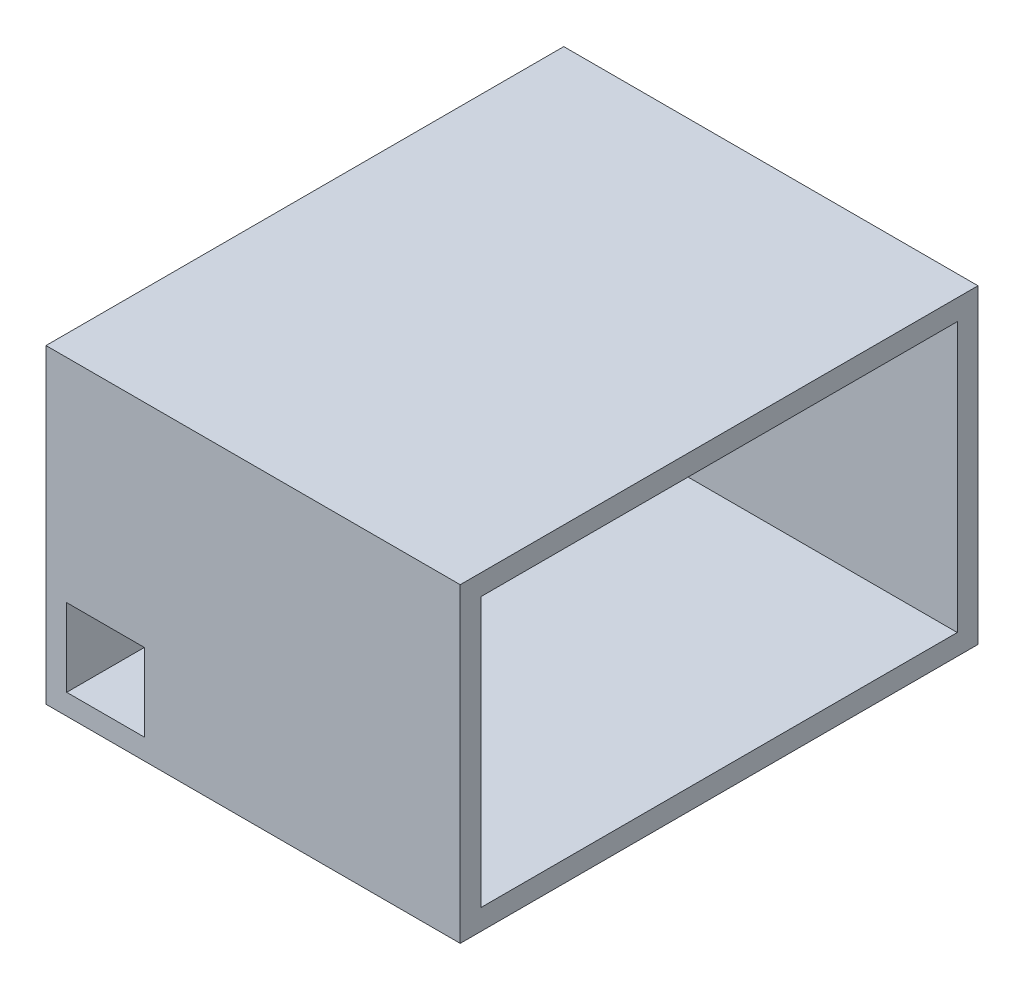
ISO-10303-21;
HEADER;
FILE_DESCRIPTION(('STEP AP214'),'2;1');
FILE_NAME('part.step','',(''),(''),'','','');
FILE_SCHEMA(('AUTOMOTIVE_DESIGN { 1 0 10303 214 1 1 1 1 }'));
ENDSEC;
DATA;
#1=APPLICATION_CONTEXT('core data for automotive mechanical design processes');
#2=APPLICATION_PROTOCOL_DEFINITION('international standard','automotive_design',2000,#1);
#3=PRODUCT_CONTEXT('',#1,'mechanical');
#4=PRODUCT('Part','Part','',(#3));
#5=PRODUCT_RELATED_PRODUCT_CATEGORY('part','',(#4));
#6=PRODUCT_DEFINITION_FORMATION('','',#4);
#7=PRODUCT_DEFINITION_CONTEXT('part definition',#1,'design');
#8=PRODUCT_DEFINITION('design','',#6,#7);
#9=PRODUCT_DEFINITION_SHAPE('','',#8);
#10=(LENGTH_UNIT() NAMED_UNIT(*) SI_UNIT(.MILLI.,.METRE.));
#11=(NAMED_UNIT(*) PLANE_ANGLE_UNIT() SI_UNIT($,.RADIAN.));
#12=(NAMED_UNIT(*) SI_UNIT($,.STERADIAN.) SOLID_ANGLE_UNIT());
#13=UNCERTAINTY_MEASURE_WITH_UNIT(LENGTH_MEASURE(1.E-05),#10,'distance_accuracy_value','');
#14=(GEOMETRIC_REPRESENTATION_CONTEXT(3) GLOBAL_UNCERTAINTY_ASSIGNED_CONTEXT((#13)) GLOBAL_UNIT_ASSIGNED_CONTEXT((#10,
#11,#12)) REPRESENTATION_CONTEXT('',''));
#15=CARTESIAN_POINT('',(0.,0.,0.));
#16=DIRECTION('',(0.,0.,1.));
#17=DIRECTION('',(1.,0.,0.));
#18=AXIS2_PLACEMENT_3D('',#15,#16,#17);
#19=CARTESIAN_POINT('',(-36.,0.,46.));
#20=DIRECTION('',(0.,0.,1.));
#21=DIRECTION('',(1.,0.,0.));
#22=AXIS2_PLACEMENT_3D('',#19,#20,#21);
#23=PLANE('',#22);
#24=DIRECTION('',(1.,0.,0.));
#25=VECTOR('',#24,1.);
#26=CARTESIAN_POINT('',(0.,19.,46.));
#27=LINE('',#26,#25);
#28=CARTESIAN_POINT('',(-36.,19.,46.));
#29=VERTEX_POINT('',#28);
#30=CARTESIAN_POINT('',(-21.,19.,46.));
#31=VERTEX_POINT('',#30);
#32=EDGE_CURVE('E133',#29,#31,#27,.T.);
#33=ORIENTED_EDGE('',*,*,#32,.F.);
#34=DIRECTION('',(0.,-1.,0.));
#35=VECTOR('',#34,1.);
#36=CARTESIAN_POINT('',(-36.,0.,46.));
#37=LINE('',#36,#35);
#38=CARTESIAN_POINT('',(-36.,56.,46.));
#39=VERTEX_POINT('',#38);
#40=EDGE_CURVE('E251',#39,#29,#37,.T.);
#41=ORIENTED_EDGE('',*,*,#40,.F.);
#42=DIRECTION('',(1.,0.,0.));
#43=VECTOR('',#42,1.);
#44=CARTESIAN_POINT('',(-36.,56.,46.));
#45=LINE('',#44,#43);
#46=CARTESIAN_POINT('',(40.,56.,46.));
#47=VERTEX_POINT('',#46);
#48=EDGE_CURVE('E147',#39,#47,#45,.T.);
#49=ORIENTED_EDGE('',*,*,#48,.T.);
#50=DIRECTION('',(0.,-1.,0.));
#51=VECTOR('',#50,1.);
#52=CARTESIAN_POINT('',(40.,0.,46.));
#53=LINE('',#52,#51);
#54=CARTESIAN_POINT('',(40.,4.,46.));
#55=VERTEX_POINT('',#54);
#56=EDGE_CURVE('E144',#47,#55,#53,.T.);
#57=ORIENTED_EDGE('',*,*,#56,.T.);
#58=DIRECTION('',(1.,0.,0.));
#59=VECTOR('',#58,1.);
#60=CARTESIAN_POINT('',(-36.,4.,46.));
#61=LINE('',#60,#59);
#62=CARTESIAN_POINT('',(-21.,4.,46.));
#63=VERTEX_POINT('',#62);
#64=EDGE_CURVE('E127',#63,#55,#61,.T.);
#65=ORIENTED_EDGE('',*,*,#64,.F.);
#66=DIRECTION('',(0.,1.,0.));
#67=VECTOR('',#66,1.);
#68=CARTESIAN_POINT('',(-21.,0.,46.));
#69=LINE('',#68,#67);
#70=EDGE_CURVE('E137',#63,#31,#69,.T.);
#71=ORIENTED_EDGE('',*,*,#70,.T.);
#72=EDGE_LOOP('',(#33,#41,#49,#57,#65,#71));
#73=FACE_BOUND('',#72,.T.);
#74=ADVANCED_FACE('F41',(#73),#23,.F.);
#75=CARTESIAN_POINT('',(40.,60.,50.));
#76=DIRECTION('',(-1.,0.,0.));
#77=DIRECTION('',(0.,0.,1.));
#78=AXIS2_PLACEMENT_3D('',#75,#76,#77);
#79=PLANE('',#78);
#80=DIRECTION('',(0.,0.,-1.));
#81=VECTOR('',#80,1.);
#82=CARTESIAN_POINT('',(40.,0.,50.));
#83=LINE('',#82,#81);
#84=CARTESIAN_POINT('',(40.,0.,50.));
#85=VERTEX_POINT('',#84);
#86=CARTESIAN_POINT('',(40.,0.,-50.));
#87=VERTEX_POINT('',#86);
#88=EDGE_CURVE('E149',#85,#87,#83,.T.);
#89=ORIENTED_EDGE('',*,*,#88,.T.);
#90=DIRECTION('',(0.,-1.,0.));
#91=VECTOR('',#90,1.);
#92=CARTESIAN_POINT('',(40.,60.,-50.));
#93=LINE('',#92,#91);
#94=CARTESIAN_POINT('',(40.,60.,-50.));
#95=VERTEX_POINT('',#94);
#96=EDGE_CURVE('E11',#95,#87,#93,.T.);
#97=ORIENTED_EDGE('',*,*,#96,.F.);
#98=DIRECTION('',(0.,0.,-1.));
#99=VECTOR('',#98,1.);
#100=CARTESIAN_POINT('',(40.,60.,50.));
#101=LINE('',#100,#99);
#102=CARTESIAN_POINT('',(40.,60.,50.));
#103=VERTEX_POINT('',#102);
#104=EDGE_CURVE('E157',#103,#95,#101,.T.);
#105=ORIENTED_EDGE('',*,*,#104,.F.);
#106=DIRECTION('',(0.,-1.,0.));
#107=VECTOR('',#106,1.);
#108=CARTESIAN_POINT('',(40.,60.,50.));
#109=LINE('',#108,#107);
#110=EDGE_CURVE('E167',#103,#85,#109,.T.);
#111=ORIENTED_EDGE('',*,*,#110,.T.);
#112=EDGE_LOOP('',(#89,#97,#105,#111));
#113=FACE_BOUND('',#112,.T.);
#114=DIRECTION('',(0.,-1.,0.));
#115=VECTOR('',#114,1.);
#116=CARTESIAN_POINT('',(40.,0.,-46.));
#117=LINE('',#116,#115);
#118=CARTESIAN_POINT('',(40.,56.,-46.));
#119=VERTEX_POINT('',#118);
#120=CARTESIAN_POINT('',(40.,4.,-46.));
#121=VERTEX_POINT('',#120);
#122=EDGE_CURVE('E64',#119,#121,#117,.T.);
#123=ORIENTED_EDGE('',*,*,#122,.T.);
#124=DIRECTION('',(0.,0.,-1.));
#125=VECTOR('',#124,1.);
#126=CARTESIAN_POINT('',(40.,4.,0.));
#127=LINE('',#126,#125);
#128=EDGE_CURVE('E249',#55,#121,#127,.T.);
#129=ORIENTED_EDGE('',*,*,#128,.F.);
#130=ORIENTED_EDGE('',*,*,#56,.F.);
#131=DIRECTION('',(0.,0.,-1.));
#132=VECTOR('',#131,1.);
#133=CARTESIAN_POINT('',(40.,56.,0.));
#134=LINE('',#133,#132);
#135=EDGE_CURVE('E257',#47,#119,#134,.T.);
#136=ORIENTED_EDGE('',*,*,#135,.T.);
#137=EDGE_LOOP('',(#123,#129,#130,#136));
#138=FACE_BOUND('',#137,.T.);
#139=ADVANCED_FACE('F43',(#113,#138),#79,.F.);
#140=CARTESIAN_POINT('',(-40.,60.,-50.));
#141=DIRECTION('',(0.,0.,1.));
#142=DIRECTION('',(1.,0.,0.));
#143=AXIS2_PLACEMENT_3D('',#140,#141,#142);
#144=PLANE('',#143);
#145=DIRECTION('',(-1.,0.,0.));
#146=VECTOR('',#145,1.);
#147=CARTESIAN_POINT('',(-40.,0.,-50.));
#148=LINE('',#147,#146);
#149=CARTESIAN_POINT('',(-40.,0.,-50.));
#150=VERTEX_POINT('',#149);
#151=EDGE_CURVE('E170',#87,#150,#148,.T.);
#152=ORIENTED_EDGE('',*,*,#151,.T.);
#153=DIRECTION('',(0.,-1.,0.));
#154=VECTOR('',#153,1.);
#155=CARTESIAN_POINT('',(-40.,60.,-50.));
#156=LINE('',#155,#154);
#157=CARTESIAN_POINT('',(-40.,60.,-50.));
#158=VERTEX_POINT('',#157);
#159=EDGE_CURVE('E49',#158,#150,#156,.T.);
#160=ORIENTED_EDGE('',*,*,#159,.F.);
#161=DIRECTION('',(-1.,0.,0.));
#162=VECTOR('',#161,1.);
#163=CARTESIAN_POINT('',(-40.,60.,-50.));
#164=LINE('',#163,#162);
#165=EDGE_CURVE('E160',#95,#158,#164,.T.);
#166=ORIENTED_EDGE('',*,*,#165,.F.);
#167=ORIENTED_EDGE('',*,*,#96,.T.);
#168=EDGE_LOOP('',(#152,#160,#166,#167));
#169=FACE_BOUND('',#168,.T.);
#170=ADVANCED_FACE('F201',(#169),#144,.F.);
#171=CARTESIAN_POINT('',(-40.,60.,50.));
#172=DIRECTION('',(1.,0.,0.));
#173=DIRECTION('',(0.,0.,-1.));
#174=AXIS2_PLACEMENT_3D('',#171,#172,#173);
#175=PLANE('',#174);
#176=DIRECTION('',(0.,0.,1.));
#177=VECTOR('',#176,1.);
#178=CARTESIAN_POINT('',(-40.,0.,50.));
#179=LINE('',#178,#177);
#180=CARTESIAN_POINT('',(-40.,0.,50.));
#181=VERTEX_POINT('',#180);
#182=EDGE_CURVE('E172',#150,#181,#179,.T.);
#183=ORIENTED_EDGE('',*,*,#182,.T.);
#184=DIRECTION('',(0.,-1.,0.));
#185=VECTOR('',#184,1.);
#186=CARTESIAN_POINT('',(-40.,60.,50.));
#187=LINE('',#186,#185);
#188=CARTESIAN_POINT('',(-40.,60.,50.));
#189=VERTEX_POINT('',#188);
#190=EDGE_CURVE('E177',#189,#181,#187,.T.);
#191=ORIENTED_EDGE('',*,*,#190,.F.);
#192=DIRECTION('',(0.,0.,1.));
#193=VECTOR('',#192,1.);
#194=CARTESIAN_POINT('',(-40.,60.,50.));
#195=LINE('',#194,#193);
#196=EDGE_CURVE('E163',#158,#189,#195,.T.);
#197=ORIENTED_EDGE('',*,*,#196,.F.);
#198=ORIENTED_EDGE('',*,*,#159,.T.);
#199=EDGE_LOOP('',(#183,#191,#197,#198));
#200=FACE_BOUND('',#199,.T.);
#201=ADVANCED_FACE('F184',(#200),#175,.F.);
#202=CARTESIAN_POINT('',(-40.,60.,50.));
#203=DIRECTION('',(0.,0.,-1.));
#204=DIRECTION('',(-1.,0.,0.));
#205=AXIS2_PLACEMENT_3D('',#202,#203,#204);
#206=PLANE('',#205);
#207=DIRECTION('',(0.,1.,0.));
#208=VECTOR('',#207,1.);
#209=CARTESIAN_POINT('',(-21.,0.,50.));
#210=LINE('',#209,#208);
#211=CARTESIAN_POINT('',(-21.,4.,50.));
#212=VERTEX_POINT('',#211);
#213=CARTESIAN_POINT('',(-21.,19.,50.));
#214=VERTEX_POINT('',#213);
#215=EDGE_CURVE('E233',#212,#214,#210,.T.);
#216=ORIENTED_EDGE('',*,*,#215,.F.);
#217=DIRECTION('',(1.,0.,0.));
#218=VECTOR('',#217,1.);
#219=CARTESIAN_POINT('',(0.,4.,50.));
#220=LINE('',#219,#218);
#221=CARTESIAN_POINT('',(-36.,4.,50.));
#222=VERTEX_POINT('',#221);
#223=EDGE_CURVE('E56',#222,#212,#220,.T.);
#224=ORIENTED_EDGE('',*,*,#223,.F.);
#225=DIRECTION('',(0.,1.,0.));
#226=VECTOR('',#225,1.);
#227=CARTESIAN_POINT('',(-36.,0.,50.));
#228=LINE('',#227,#226);
#229=CARTESIAN_POINT('',(-36.,19.,50.));
#230=VERTEX_POINT('',#229);
#231=EDGE_CURVE('E141',#222,#230,#228,.T.);
#232=ORIENTED_EDGE('',*,*,#231,.T.);
#233=DIRECTION('',(1.,0.,0.));
#234=VECTOR('',#233,1.);
#235=CARTESIAN_POINT('',(0.,19.,50.));
#236=LINE('',#235,#234);
#237=EDGE_CURVE('E236',#230,#214,#236,.T.);
#238=ORIENTED_EDGE('',*,*,#237,.T.);
#239=EDGE_LOOP('',(#216,#224,#232,#238));
#240=FACE_BOUND('',#239,.T.);
#241=DIRECTION('',(1.,0.,0.));
#242=VECTOR('',#241,1.);
#243=CARTESIAN_POINT('',(-40.,0.,50.));
#244=LINE('',#243,#242);
#245=EDGE_CURVE('E161',#181,#85,#244,.T.);
#246=ORIENTED_EDGE('',*,*,#245,.T.);
#247=ORIENTED_EDGE('',*,*,#110,.F.);
#248=DIRECTION('',(1.,0.,0.));
#249=VECTOR('',#248,1.);
#250=CARTESIAN_POINT('',(-40.,60.,50.));
#251=LINE('',#250,#249);
#252=EDGE_CURVE('E165',#189,#103,#251,.T.);
#253=ORIENTED_EDGE('',*,*,#252,.F.);
#254=ORIENTED_EDGE('',*,*,#190,.T.);
#255=EDGE_LOOP('',(#246,#247,#253,#254));
#256=FACE_BOUND('',#255,.T.);
#257=ADVANCED_FACE('F193',(#240,#256),#206,.F.);
#258=CARTESIAN_POINT('',(0.,60.,0.));
#259=DIRECTION('',(0.,-1.,0.));
#260=DIRECTION('',(0.,0.,-1.));
#261=AXIS2_PLACEMENT_3D('',#258,#259,#260);
#262=PLANE('',#261);
#263=ORIENTED_EDGE('',*,*,#104,.T.);
#264=ORIENTED_EDGE('',*,*,#165,.T.);
#265=ORIENTED_EDGE('',*,*,#196,.T.);
#266=ORIENTED_EDGE('',*,*,#252,.T.);
#267=EDGE_LOOP('',(#263,#264,#265,#266));
#268=FACE_BOUND('',#267,.T.);
#269=ADVANCED_FACE('F200',(#268),#262,.F.);
#270=CARTESIAN_POINT('',(0.,0.,0.));
#271=DIRECTION('',(0.,-1.,0.));
#272=DIRECTION('',(0.,0.,-1.));
#273=AXIS2_PLACEMENT_3D('',#270,#271,#272);
#274=PLANE('',#273);
#275=ORIENTED_EDGE('',*,*,#88,.F.);
#276=ORIENTED_EDGE('',*,*,#245,.F.);
#277=ORIENTED_EDGE('',*,*,#182,.F.);
#278=ORIENTED_EDGE('',*,*,#151,.F.);
#279=EDGE_LOOP('',(#275,#276,#277,#278));
#280=FACE_BOUND('',#279,.T.);
#281=ADVANCED_FACE('F190',(#280),#274,.T.);
#282=CARTESIAN_POINT('',(-36.,0.,-46.));
#283=DIRECTION('',(0.,0.,1.));
#284=DIRECTION('',(1.,0.,0.));
#285=AXIS2_PLACEMENT_3D('',#282,#283,#284);
#286=PLANE('',#285);
#287=ORIENTED_EDGE('',*,*,#122,.F.);
#288=DIRECTION('',(1.,0.,0.));
#289=VECTOR('',#288,1.);
#290=CARTESIAN_POINT('',(-36.,56.,-46.));
#291=LINE('',#290,#289);
#292=CARTESIAN_POINT('',(-36.,56.,-46.));
#293=VERTEX_POINT('',#292);
#294=EDGE_CURVE('E151',#293,#119,#291,.T.);
#295=ORIENTED_EDGE('',*,*,#294,.F.);
#296=DIRECTION('',(0.,-1.,0.));
#297=VECTOR('',#296,1.);
#298=CARTESIAN_POINT('',(-36.,0.,-46.));
#299=LINE('',#298,#297);
#300=CARTESIAN_POINT('',(-36.,4.,-46.));
#301=VERTEX_POINT('',#300);
#302=EDGE_CURVE('E246',#293,#301,#299,.T.);
#303=ORIENTED_EDGE('',*,*,#302,.T.);
#304=DIRECTION('',(1.,0.,0.));
#305=VECTOR('',#304,1.);
#306=CARTESIAN_POINT('',(-36.,4.,-46.));
#307=LINE('',#306,#305);
#308=EDGE_CURVE('E146',#301,#121,#307,.T.);
#309=ORIENTED_EDGE('',*,*,#308,.T.);
#310=EDGE_LOOP('',(#287,#295,#303,#309));
#311=FACE_BOUND('',#310,.T.);
#312=ADVANCED_FACE('F221',(#311),#286,.T.);
#313=CARTESIAN_POINT('',(-36.,4.,0.));
#314=DIRECTION('',(0.,-1.,0.));
#315=DIRECTION('',(0.,0.,-1.));
#316=AXIS2_PLACEMENT_3D('',#313,#314,#315);
#317=PLANE('',#316);
#318=ORIENTED_EDGE('',*,*,#128,.T.);
#319=ORIENTED_EDGE('',*,*,#308,.F.);
#320=DIRECTION('',(0.,0.,-1.));
#321=VECTOR('',#320,1.);
#322=CARTESIAN_POINT('',(-36.,4.,0.));
#323=LINE('',#322,#321);
#324=EDGE_CURVE('E156',#222,#301,#323,.T.);
#325=ORIENTED_EDGE('',*,*,#324,.F.);
#326=ORIENTED_EDGE('',*,*,#223,.T.);
#327=DIRECTION('',(0.,0.,1.));
#328=VECTOR('',#327,1.);
#329=CARTESIAN_POINT('',(-21.,4.,46.));
#330=LINE('',#329,#328);
#331=EDGE_CURVE('E122',#63,#212,#330,.T.);
#332=ORIENTED_EDGE('',*,*,#331,.F.);
#333=ORIENTED_EDGE('',*,*,#64,.T.);
#334=EDGE_LOOP('',(#318,#319,#325,#326,#332,#333));
#335=FACE_BOUND('',#334,.T.);
#336=ADVANCED_FACE('F125',(#335),#317,.F.);
#337=CARTESIAN_POINT('',(-36.,56.,0.));
#338=DIRECTION('',(0.,-1.,0.));
#339=DIRECTION('',(0.,0.,-1.));
#340=AXIS2_PLACEMENT_3D('',#337,#338,#339);
#341=PLANE('',#340);
#342=ORIENTED_EDGE('',*,*,#135,.F.);
#343=ORIENTED_EDGE('',*,*,#48,.F.);
#344=DIRECTION('',(0.,0.,-1.));
#345=VECTOR('',#344,1.);
#346=CARTESIAN_POINT('',(-36.,56.,0.));
#347=LINE('',#346,#345);
#348=EDGE_CURVE('E248',#39,#293,#347,.T.);
#349=ORIENTED_EDGE('',*,*,#348,.T.);
#350=ORIENTED_EDGE('',*,*,#294,.T.);
#351=EDGE_LOOP('',(#342,#343,#349,#350));
#352=FACE_BOUND('',#351,.T.);
#353=ADVANCED_FACE('F217',(#352),#341,.T.);
#354=CARTESIAN_POINT('',(-36.,0.,0.));
#355=DIRECTION('',(1.,0.,0.));
#356=DIRECTION('',(0.,0.,-1.));
#357=AXIS2_PLACEMENT_3D('',#354,#355,#356);
#358=PLANE('',#357);
#359=ORIENTED_EDGE('',*,*,#302,.F.);
#360=ORIENTED_EDGE('',*,*,#348,.F.);
#361=ORIENTED_EDGE('',*,*,#40,.T.);
#362=DIRECTION('',(0.,0.,1.));
#363=VECTOR('',#362,1.);
#364=CARTESIAN_POINT('',(-36.,19.,46.));
#365=LINE('',#364,#363);
#366=EDGE_CURVE('E243',#29,#230,#365,.T.);
#367=ORIENTED_EDGE('',*,*,#366,.T.);
#368=ORIENTED_EDGE('',*,*,#231,.F.);
#369=ORIENTED_EDGE('',*,*,#324,.T.);
#370=EDGE_LOOP('',(#359,#360,#361,#367,#368,#369));
#371=FACE_BOUND('',#370,.T.);
#372=ADVANCED_FACE('F219',(#371),#358,.T.);
#373=CARTESIAN_POINT('',(0.,19.,46.));
#374=DIRECTION('',(0.,-1.,0.));
#375=DIRECTION('',(0.,0.,-1.));
#376=AXIS2_PLACEMENT_3D('',#373,#374,#375);
#377=PLANE('',#376);
#378=ORIENTED_EDGE('',*,*,#237,.F.);
#379=ORIENTED_EDGE('',*,*,#366,.F.);
#380=ORIENTED_EDGE('',*,*,#32,.T.);
#381=DIRECTION('',(0.,0.,1.));
#382=VECTOR('',#381,1.);
#383=CARTESIAN_POINT('',(-21.,19.,46.));
#384=LINE('',#383,#382);
#385=EDGE_CURVE('E132',#31,#214,#384,.T.);
#386=ORIENTED_EDGE('',*,*,#385,.T.);
#387=EDGE_LOOP('',(#378,#379,#380,#386));
#388=FACE_BOUND('',#387,.T.);
#389=ADVANCED_FACE('F268',(#388),#377,.T.);
#390=CARTESIAN_POINT('',(-21.,0.,46.));
#391=DIRECTION('',(1.,0.,0.));
#392=DIRECTION('',(0.,0.,-1.));
#393=AXIS2_PLACEMENT_3D('',#390,#391,#392);
#394=PLANE('',#393);
#395=ORIENTED_EDGE('',*,*,#215,.T.);
#396=ORIENTED_EDGE('',*,*,#385,.F.);
#397=ORIENTED_EDGE('',*,*,#70,.F.);
#398=ORIENTED_EDGE('',*,*,#331,.T.);
#399=EDGE_LOOP('',(#395,#396,#397,#398));
#400=FACE_BOUND('',#399,.T.);
#401=ADVANCED_FACE('F138',(#400),#394,.F.);
#402=CLOSED_SHELL('',(#74,#139,#170,#201,#257,#269,#281,#312,#336,#353,#372,#389,#401));
#403=MANIFOLD_SOLID_BREP('B2',#402);
#404=ADVANCED_BREP_SHAPE_REPRESENTATION('',(#18,#403),#14);
#405=SHAPE_DEFINITION_REPRESENTATION(#9,#404);
ENDSEC;
END-ISO-10303-21;
